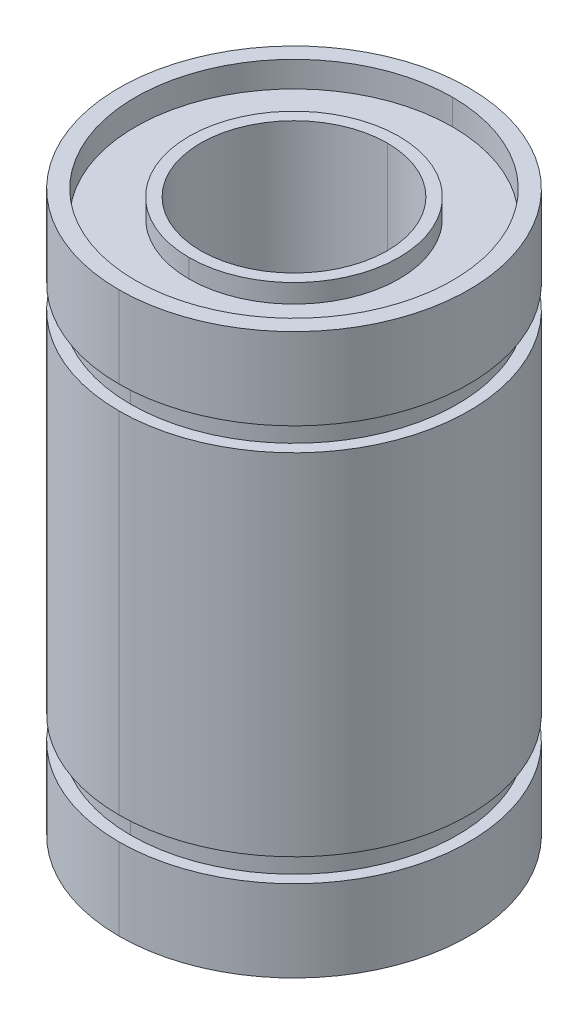
ISO-10303-21;
HEADER;
FILE_DESCRIPTION(('STEP AP214'),'2;1');
FILE_NAME('part.step','',(''),(''),'','','');
FILE_SCHEMA(('AUTOMOTIVE_DESIGN { 1 0 10303 214 1 1 1 1 }'));
ENDSEC;
DATA;
#1=APPLICATION_CONTEXT('core data for automotive mechanical design processes');
#2=APPLICATION_PROTOCOL_DEFINITION('international standard','automotive_design',2000,#1);
#3=PRODUCT_CONTEXT('',#1,'mechanical');
#4=PRODUCT('Part','Part','',(#3));
#5=PRODUCT_RELATED_PRODUCT_CATEGORY('part','',(#4));
#6=PRODUCT_DEFINITION_FORMATION('','',#4);
#7=PRODUCT_DEFINITION_CONTEXT('part definition',#1,'design');
#8=PRODUCT_DEFINITION('design','',#6,#7);
#9=PRODUCT_DEFINITION_SHAPE('','',#8);
#10=(LENGTH_UNIT() NAMED_UNIT(*) SI_UNIT(.MILLI.,.METRE.));
#11=(NAMED_UNIT(*) PLANE_ANGLE_UNIT() SI_UNIT($,.RADIAN.));
#12=(NAMED_UNIT(*) SI_UNIT($,.STERADIAN.) SOLID_ANGLE_UNIT());
#13=UNCERTAINTY_MEASURE_WITH_UNIT(LENGTH_MEASURE(1.E-05),#10,'distance_accuracy_value','');
#14=(GEOMETRIC_REPRESENTATION_CONTEXT(3) GLOBAL_UNCERTAINTY_ASSIGNED_CONTEXT((#13)) GLOBAL_UNIT_ASSIGNED_CONTEXT((#10,
#11,#12)) REPRESENTATION_CONTEXT('',''));
#15=CARTESIAN_POINT('',(0.,0.,0.));
#16=DIRECTION('',(0.,0.,1.));
#17=DIRECTION('',(1.,0.,0.));
#18=AXIS2_PLACEMENT_3D('',#15,#16,#17);
#19=CARTESIAN_POINT('',(0.,-10.5,0.));
#20=DIRECTION('',(0.,-1.,0.));
#21=DIRECTION('',(0.,0.,1.));
#22=AXIS2_PLACEMENT_3D('',#19,#20,#21);
#23=CYLINDRICAL_SURFACE('',#22,4.5);
#24=CARTESIAN_POINT('',(0.,-10.9,0.));
#25=DIRECTION('',(0.,1.,0.));
#26=DIRECTION('',(0.,0.,1.));
#27=AXIS2_PLACEMENT_3D('',#24,#25,#26);
#28=CIRCLE('',#27,4.5);
#29=CARTESIAN_POINT('',(0.,-10.9,-4.5));
#30=VERTEX_POINT('',#29);
#31=CARTESIAN_POINT('',(0.,-10.9,4.5));
#32=VERTEX_POINT('',#31);
#33=EDGE_CURVE('E40',#30,#32,#28,.T.);
#34=ORIENTED_EDGE('',*,*,#33,.F.);
#35=DIRECTION('',(0.,-1.,0.));
#36=VECTOR('',#35,1.);
#37=CARTESIAN_POINT('',(0.,-10.5,-4.5));
#38=LINE('',#37,#36);
#39=CARTESIAN_POINT('',(0.,-11.7,-4.5));
#40=VERTEX_POINT('',#39);
#41=EDGE_CURVE('E10',#30,#40,#38,.T.);
#42=ORIENTED_EDGE('',*,*,#41,.T.);
#43=CARTESIAN_POINT('',(0.,-11.7,0.));
#44=DIRECTION('',(0.,1.,0.));
#45=DIRECTION('',(0.,0.,1.));
#46=AXIS2_PLACEMENT_3D('',#43,#44,#45);
#47=CIRCLE('',#46,4.5);
#48=CARTESIAN_POINT('',(0.,-11.7,4.5));
#49=VERTEX_POINT('',#48);
#50=EDGE_CURVE('E26',#40,#49,#47,.T.);
#51=ORIENTED_EDGE('',*,*,#50,.T.);
#52=DIRECTION('',(0.,-1.,0.));
#53=VECTOR('',#52,1.);
#54=CARTESIAN_POINT('',(0.,-10.5,4.5));
#55=LINE('',#54,#53);
#56=EDGE_CURVE('E187',#32,#49,#55,.T.);
#57=ORIENTED_EDGE('',*,*,#56,.F.);
#58=EDGE_LOOP('',(#34,#42,#51,#57));
#59=FACE_BOUND('',#58,.T.);
#60=ADVANCED_FACE('F15',(#59),#23,.T.);
#61=CARTESIAN_POINT('',(0.,-10.5,0.));
#62=DIRECTION('',(0.,-1.,0.));
#63=DIRECTION('',(0.,0.,1.));
#64=AXIS2_PLACEMENT_3D('',#61,#62,#63);
#65=CYLINDRICAL_SURFACE('',#64,6.8);
#66=CARTESIAN_POINT('',(0.,-10.9,0.));
#67=DIRECTION('',(0.,1.,0.));
#68=DIRECTION('',(0.,0.,1.));
#69=AXIS2_PLACEMENT_3D('',#66,#67,#68);
#70=CIRCLE('',#69,6.8);
#71=CARTESIAN_POINT('',(0.,-10.9,6.8));
#72=VERTEX_POINT('',#71);
#73=CARTESIAN_POINT('',(0.,-10.9,-6.8));
#74=VERTEX_POINT('',#73);
#75=EDGE_CURVE('E159',#72,#74,#70,.T.);
#76=ORIENTED_EDGE('',*,*,#75,.T.);
#77=DIRECTION('',(0.,-1.,0.));
#78=VECTOR('',#77,1.);
#79=CARTESIAN_POINT('',(0.,-10.5,-6.8));
#80=LINE('',#79,#78);
#81=CARTESIAN_POINT('',(0.,-12.,-6.8));
#82=VERTEX_POINT('',#81);
#83=EDGE_CURVE('E136',#74,#82,#80,.T.);
#84=ORIENTED_EDGE('',*,*,#83,.T.);
#85=CARTESIAN_POINT('',(0.,-12.,0.));
#86=DIRECTION('',(0.,1.,0.));
#87=DIRECTION('',(0.,0.,1.));
#88=AXIS2_PLACEMENT_3D('',#85,#86,#87);
#89=CIRCLE('',#88,6.8);
#90=CARTESIAN_POINT('',(0.,-12.,6.8));
#91=VERTEX_POINT('',#90);
#92=EDGE_CURVE('E213',#91,#82,#89,.T.);
#93=ORIENTED_EDGE('',*,*,#92,.F.);
#94=DIRECTION('',(0.,-1.,0.));
#95=VECTOR('',#94,1.);
#96=CARTESIAN_POINT('',(0.,-10.5,6.8));
#97=LINE('',#96,#95);
#98=EDGE_CURVE('E308',#72,#91,#97,.T.);
#99=ORIENTED_EDGE('',*,*,#98,.F.);
#100=EDGE_LOOP('',(#76,#84,#93,#99));
#101=FACE_BOUND('',#100,.T.);
#102=ADVANCED_FACE('F373',(#101),#65,.F.);
#103=CARTESIAN_POINT('',(0.,-7.5,0.));
#104=DIRECTION('',(0.,-1.,0.));
#105=DIRECTION('',(0.,0.,-1.));
#106=AXIS2_PLACEMENT_3D('',#103,#104,#105);
#107=CYLINDRICAL_SURFACE('',#106,7.);
#108=CARTESIAN_POINT('',(0.,-7.5,0.));
#109=DIRECTION('',(0.,1.,0.));
#110=DIRECTION('',(0.,0.,1.));
#111=AXIS2_PLACEMENT_3D('',#108,#109,#110);
#112=CIRCLE('',#111,7.);
#113=CARTESIAN_POINT('',(0.,-7.5,7.));
#114=VERTEX_POINT('',#113);
#115=CARTESIAN_POINT('',(0.,-7.5,-7.));
#116=VERTEX_POINT('',#115);
#117=EDGE_CURVE('E119',#114,#116,#112,.T.);
#118=ORIENTED_EDGE('',*,*,#117,.F.);
#119=DIRECTION('',(0.,-1.,0.));
#120=VECTOR('',#119,1.);
#121=CARTESIAN_POINT('',(0.,-7.5,7.));
#122=LINE('',#121,#120);
#123=CARTESIAN_POINT('',(0.,-8.5,7.));
#124=VERTEX_POINT('',#123);
#125=EDGE_CURVE('E122',#114,#124,#122,.T.);
#126=ORIENTED_EDGE('',*,*,#125,.T.);
#127=CARTESIAN_POINT('',(0.,-8.5,0.));
#128=DIRECTION('',(0.,1.,0.));
#129=DIRECTION('',(0.,0.,1.));
#130=AXIS2_PLACEMENT_3D('',#127,#128,#129);
#131=CIRCLE('',#130,7.);
#132=CARTESIAN_POINT('',(0.,-8.5,-7.));
#133=VERTEX_POINT('',#132);
#134=EDGE_CURVE('E110',#124,#133,#131,.T.);
#135=ORIENTED_EDGE('',*,*,#134,.T.);
#136=DIRECTION('',(0.,-1.,0.));
#137=VECTOR('',#136,1.);
#138=CARTESIAN_POINT('',(0.,-7.5,-7.));
#139=LINE('',#138,#137);
#140=EDGE_CURVE('E124',#116,#133,#139,.T.);
#141=ORIENTED_EDGE('',*,*,#140,.F.);
#142=EDGE_LOOP('',(#118,#126,#135,#141));
#143=FACE_BOUND('',#142,.T.);
#144=ADVANCED_FACE('F121',(#143),#107,.T.);
#145=CARTESIAN_POINT('',(0.,10.5,0.));
#146=DIRECTION('',(0.,1.,0.));
#147=DIRECTION('',(0.,0.,1.));
#148=AXIS2_PLACEMENT_3D('',#145,#146,#147);
#149=CYLINDRICAL_SURFACE('',#148,4.5);
#150=CARTESIAN_POINT('',(0.,10.9,0.));
#151=DIRECTION('',(0.,1.,0.));
#152=DIRECTION('',(0.,0.,1.));
#153=AXIS2_PLACEMENT_3D('',#150,#151,#152);
#154=CIRCLE('',#153,4.5);
#155=CARTESIAN_POINT('',(0.,10.9,4.5));
#156=VERTEX_POINT('',#155);
#157=CARTESIAN_POINT('',(0.,10.9,-4.5));
#158=VERTEX_POINT('',#157);
#159=EDGE_CURVE('E228',#156,#158,#154,.T.);
#160=ORIENTED_EDGE('',*,*,#159,.T.);
#161=DIRECTION('',(0.,1.,0.));
#162=VECTOR('',#161,1.);
#163=CARTESIAN_POINT('',(0.,10.5,-4.5));
#164=LINE('',#163,#162);
#165=CARTESIAN_POINT('',(0.,11.7,-4.5));
#166=VERTEX_POINT('',#165);
#167=EDGE_CURVE('E224',#158,#166,#164,.T.);
#168=ORIENTED_EDGE('',*,*,#167,.T.);
#169=CARTESIAN_POINT('',(0.,11.7,0.));
#170=DIRECTION('',(0.,1.,0.));
#171=DIRECTION('',(0.,0.,1.));
#172=AXIS2_PLACEMENT_3D('',#169,#170,#171);
#173=CIRCLE('',#172,4.5);
#174=CARTESIAN_POINT('',(0.,11.7,4.5));
#175=VERTEX_POINT('',#174);
#176=EDGE_CURVE('E203',#175,#166,#173,.T.);
#177=ORIENTED_EDGE('',*,*,#176,.F.);
#178=DIRECTION('',(0.,1.,0.));
#179=VECTOR('',#178,1.);
#180=CARTESIAN_POINT('',(0.,10.5,4.5));
#181=LINE('',#180,#179);
#182=EDGE_CURVE('E233',#156,#175,#181,.T.);
#183=ORIENTED_EDGE('',*,*,#182,.F.);
#184=EDGE_LOOP('',(#160,#168,#177,#183));
#185=FACE_BOUND('',#184,.T.);
#186=ADVANCED_FACE('F681',(#185),#149,.T.);
#187=CARTESIAN_POINT('',(0.,10.5,0.));
#188=DIRECTION('',(0.,1.,0.));
#189=DIRECTION('',(0.,0.,1.));
#190=AXIS2_PLACEMENT_3D('',#187,#188,#189);
#191=CYLINDRICAL_SURFACE('',#190,6.8);
#192=CARTESIAN_POINT('',(0.,10.9,0.));
#193=DIRECTION('',(0.,1.,0.));
#194=DIRECTION('',(0.,0.,1.));
#195=AXIS2_PLACEMENT_3D('',#192,#193,#194);
#196=CIRCLE('',#195,6.8);
#197=CARTESIAN_POINT('',(0.,10.9,-6.8));
#198=VERTEX_POINT('',#197);
#199=CARTESIAN_POINT('',(0.,10.9,6.8));
#200=VERTEX_POINT('',#199);
#201=EDGE_CURVE('E140',#198,#200,#196,.T.);
#202=ORIENTED_EDGE('',*,*,#201,.F.);
#203=DIRECTION('',(0.,1.,0.));
#204=VECTOR('',#203,1.);
#205=CARTESIAN_POINT('',(0.,10.5,-6.8));
#206=LINE('',#205,#204);
#207=CARTESIAN_POINT('',(0.,12.,-6.8));
#208=VERTEX_POINT('',#207);
#209=EDGE_CURVE('E19',#198,#208,#206,.T.);
#210=ORIENTED_EDGE('',*,*,#209,.T.);
#211=CARTESIAN_POINT('',(0.,12.,0.));
#212=DIRECTION('',(0.,1.,0.));
#213=DIRECTION('',(0.,0.,1.));
#214=AXIS2_PLACEMENT_3D('',#211,#212,#213);
#215=CIRCLE('',#214,6.8);
#216=CARTESIAN_POINT('',(0.,12.,6.8));
#217=VERTEX_POINT('',#216);
#218=EDGE_CURVE('E280',#208,#217,#215,.T.);
#219=ORIENTED_EDGE('',*,*,#218,.T.);
#220=DIRECTION('',(0.,1.,0.));
#221=VECTOR('',#220,1.);
#222=CARTESIAN_POINT('',(0.,10.5,6.8));
#223=LINE('',#222,#221);
#224=EDGE_CURVE('E163',#200,#217,#223,.T.);
#225=ORIENTED_EDGE('',*,*,#224,.F.);
#226=EDGE_LOOP('',(#202,#210,#219,#225));
#227=FACE_BOUND('',#226,.T.);
#228=ADVANCED_FACE('F418',(#227),#191,.F.);
#229=CARTESIAN_POINT('',(0.,7.5,0.));
#230=DIRECTION('',(0.,1.,0.));
#231=DIRECTION('',(0.,0.,1.));
#232=AXIS2_PLACEMENT_3D('',#229,#230,#231);
#233=CYLINDRICAL_SURFACE('',#232,7.);
#234=CARTESIAN_POINT('',(0.,7.5,0.));
#235=DIRECTION('',(0.,1.,0.));
#236=DIRECTION('',(0.,0.,1.));
#237=AXIS2_PLACEMENT_3D('',#234,#235,#236);
#238=CIRCLE('',#237,7.);
#239=CARTESIAN_POINT('',(0.,7.5,7.));
#240=VERTEX_POINT('',#239);
#241=CARTESIAN_POINT('',(0.,7.5,-7.));
#242=VERTEX_POINT('',#241);
#243=EDGE_CURVE('E276',#240,#242,#238,.T.);
#244=ORIENTED_EDGE('',*,*,#243,.T.);
#245=DIRECTION('',(0.,1.,0.));
#246=VECTOR('',#245,1.);
#247=CARTESIAN_POINT('',(0.,7.5,-7.));
#248=LINE('',#247,#246);
#249=CARTESIAN_POINT('',(0.,8.5,-7.));
#250=VERTEX_POINT('',#249);
#251=EDGE_CURVE('E281',#242,#250,#248,.T.);
#252=ORIENTED_EDGE('',*,*,#251,.T.);
#253=CARTESIAN_POINT('',(0.,8.5,0.));
#254=DIRECTION('',(0.,1.,0.));
#255=DIRECTION('',(0.,0.,1.));
#256=AXIS2_PLACEMENT_3D('',#253,#254,#255);
#257=CIRCLE('',#256,7.);
#258=CARTESIAN_POINT('',(0.,8.5,7.));
#259=VERTEX_POINT('',#258);
#260=EDGE_CURVE('E285',#259,#250,#257,.T.);
#261=ORIENTED_EDGE('',*,*,#260,.F.);
#262=DIRECTION('',(0.,1.,0.));
#263=VECTOR('',#262,1.);
#264=CARTESIAN_POINT('',(0.,7.5,7.));
#265=LINE('',#264,#263);
#266=EDGE_CURVE('E152',#240,#259,#265,.T.);
#267=ORIENTED_EDGE('',*,*,#266,.F.);
#268=EDGE_LOOP('',(#244,#252,#261,#267));
#269=FACE_BOUND('',#268,.T.);
#270=ADVANCED_FACE('F415',(#269),#233,.T.);
#271=CARTESIAN_POINT('',(0.,12.,0.));
#272=DIRECTION('',(0.,-1.,0.));
#273=DIRECTION('',(0.,0.,-1.));
#274=AXIS2_PLACEMENT_3D('',#271,#272,#273);
#275=CYLINDRICAL_SURFACE('',#274,7.5);
#276=CARTESIAN_POINT('',(0.,12.,0.));
#277=DIRECTION('',(0.,1.,0.));
#278=DIRECTION('',(0.,0.,1.));
#279=AXIS2_PLACEMENT_3D('',#276,#277,#278);
#280=CIRCLE('',#279,7.5);
#281=CARTESIAN_POINT('',(0.,12.,7.5));
#282=VERTEX_POINT('',#281);
#283=CARTESIAN_POINT('',(0.,12.,-7.5));
#284=VERTEX_POINT('',#283);
#285=EDGE_CURVE('E202',#282,#284,#280,.T.);
#286=ORIENTED_EDGE('',*,*,#285,.F.);
#287=DIRECTION('',(0.,-1.,0.));
#288=VECTOR('',#287,1.);
#289=CARTESIAN_POINT('',(0.,12.,7.5));
#290=LINE('',#289,#288);
#291=CARTESIAN_POINT('',(0.,8.5,7.5));
#292=VERTEX_POINT('',#291);
#293=EDGE_CURVE('E301',#282,#292,#290,.T.);
#294=ORIENTED_EDGE('',*,*,#293,.T.);
#295=CARTESIAN_POINT('',(0.,8.5,0.));
#296=DIRECTION('',(0.,1.,0.));
#297=DIRECTION('',(0.,0.,1.));
#298=AXIS2_PLACEMENT_3D('',#295,#296,#297);
#299=CIRCLE('',#298,7.5);
#300=CARTESIAN_POINT('',(0.,8.5,-7.5));
#301=VERTEX_POINT('',#300);
#302=EDGE_CURVE('E232',#292,#301,#299,.T.);
#303=ORIENTED_EDGE('',*,*,#302,.T.);
#304=DIRECTION('',(0.,-1.,0.));
#305=VECTOR('',#304,1.);
#306=CARTESIAN_POINT('',(0.,12.,-7.5));
#307=LINE('',#306,#305);
#308=EDGE_CURVE('E193',#284,#301,#307,.T.);
#309=ORIENTED_EDGE('',*,*,#308,.F.);
#310=EDGE_LOOP('',(#286,#294,#303,#309));
#311=FACE_BOUND('',#310,.T.);
#312=ADVANCED_FACE('F393',(#311),#275,.T.);
#313=CARTESIAN_POINT('',(0.,12.,0.));
#314=DIRECTION('',(0.,-1.,0.));
#315=DIRECTION('',(0.,0.,-1.));
#316=AXIS2_PLACEMENT_3D('',#313,#314,#315);
#317=CYLINDRICAL_SURFACE('',#316,7.5);
#318=CARTESIAN_POINT('',(0.,-8.5,0.));
#319=DIRECTION('',(0.,1.,0.));
#320=DIRECTION('',(0.,0.,1.));
#321=AXIS2_PLACEMENT_3D('',#318,#319,#320);
#322=CIRCLE('',#321,7.5);
#323=CARTESIAN_POINT('',(0.,-8.5,7.5));
#324=VERTEX_POINT('',#323);
#325=CARTESIAN_POINT('',(0.,-8.5,-7.5));
#326=VERTEX_POINT('',#325);
#327=EDGE_CURVE('E182',#324,#326,#322,.T.);
#328=ORIENTED_EDGE('',*,*,#327,.F.);
#329=DIRECTION('',(0.,-1.,0.));
#330=VECTOR('',#329,1.);
#331=CARTESIAN_POINT('',(0.,12.,7.5));
#332=LINE('',#331,#330);
#333=CARTESIAN_POINT('',(0.,-12.,7.5));
#334=VERTEX_POINT('',#333);
#335=EDGE_CURVE('E186',#324,#334,#332,.T.);
#336=ORIENTED_EDGE('',*,*,#335,.T.);
#337=CARTESIAN_POINT('',(0.,-12.,0.));
#338=DIRECTION('',(0.,1.,0.));
#339=DIRECTION('',(0.,0.,1.));
#340=AXIS2_PLACEMENT_3D('',#337,#338,#339);
#341=CIRCLE('',#340,7.5);
#342=CARTESIAN_POINT('',(0.,-12.,-7.5));
#343=VERTEX_POINT('',#342);
#344=EDGE_CURVE('E157',#334,#343,#341,.T.);
#345=ORIENTED_EDGE('',*,*,#344,.T.);
#346=DIRECTION('',(0.,-1.,0.));
#347=VECTOR('',#346,1.);
#348=CARTESIAN_POINT('',(0.,12.,-7.5));
#349=LINE('',#348,#347);
#350=EDGE_CURVE('E238',#326,#343,#349,.T.);
#351=ORIENTED_EDGE('',*,*,#350,.F.);
#352=EDGE_LOOP('',(#328,#336,#345,#351));
#353=FACE_BOUND('',#352,.T.);
#354=ADVANCED_FACE('F389',(#353),#317,.T.);
#355=CARTESIAN_POINT('',(0.,12.,0.));
#356=DIRECTION('',(0.,-1.,0.));
#357=DIRECTION('',(0.,0.,-1.));
#358=AXIS2_PLACEMENT_3D('',#355,#356,#357);
#359=CYLINDRICAL_SURFACE('',#358,7.5);
#360=CARTESIAN_POINT('',(0.,7.5,0.));
#361=DIRECTION('',(0.,1.,0.));
#362=DIRECTION('',(0.,0.,1.));
#363=AXIS2_PLACEMENT_3D('',#360,#361,#362);
#364=CIRCLE('',#363,7.5);
#365=CARTESIAN_POINT('',(0.,7.5,7.5));
#366=VERTEX_POINT('',#365);
#367=CARTESIAN_POINT('',(0.,7.5,-7.5));
#368=VERTEX_POINT('',#367);
#369=EDGE_CURVE('E282',#366,#368,#364,.T.);
#370=ORIENTED_EDGE('',*,*,#369,.F.);
#371=DIRECTION('',(0.,-1.,0.));
#372=VECTOR('',#371,1.);
#373=CARTESIAN_POINT('',(0.,12.,7.5));
#374=LINE('',#373,#372);
#375=CARTESIAN_POINT('',(0.,-7.5,7.5));
#376=VERTEX_POINT('',#375);
#377=EDGE_CURVE('E154',#366,#376,#374,.T.);
#378=ORIENTED_EDGE('',*,*,#377,.T.);
#379=CARTESIAN_POINT('',(0.,-7.5,0.));
#380=DIRECTION('',(0.,1.,0.));
#381=DIRECTION('',(0.,0.,1.));
#382=AXIS2_PLACEMENT_3D('',#379,#380,#381);
#383=CIRCLE('',#382,7.5);
#384=CARTESIAN_POINT('',(0.,-7.5,-7.5));
#385=VERTEX_POINT('',#384);
#386=EDGE_CURVE('E158',#376,#385,#383,.T.);
#387=ORIENTED_EDGE('',*,*,#386,.T.);
#388=DIRECTION('',(0.,-1.,0.));
#389=VECTOR('',#388,1.);
#390=CARTESIAN_POINT('',(0.,12.,-7.5));
#391=LINE('',#390,#389);
#392=EDGE_CURVE('E168',#368,#385,#391,.T.);
#393=ORIENTED_EDGE('',*,*,#392,.F.);
#394=EDGE_LOOP('',(#370,#378,#387,#393));
#395=FACE_BOUND('',#394,.T.);
#396=ADVANCED_FACE('F392',(#395),#359,.T.);
#397=CARTESIAN_POINT('',(0.,-12.,0.));
#398=DIRECTION('',(0.,1.,0.));
#399=DIRECTION('',(0.,0.,1.));
#400=AXIS2_PLACEMENT_3D('',#397,#398,#399);
#401=CYLINDRICAL_SURFACE('',#400,4.);
#402=CARTESIAN_POINT('',(0.,-11.7,0.));
#403=DIRECTION('',(0.,1.,0.));
#404=DIRECTION('',(0.,0.,1.));
#405=AXIS2_PLACEMENT_3D('',#402,#403,#404);
#406=CIRCLE('',#405,4.);
#407=CARTESIAN_POINT('',(0.,-11.7,-4.));
#408=VERTEX_POINT('',#407);
#409=CARTESIAN_POINT('',(0.,-11.7,4.));
#410=VERTEX_POINT('',#409);
#411=EDGE_CURVE('E191',#408,#410,#406,.T.);
#412=ORIENTED_EDGE('',*,*,#411,.F.);
#413=DIRECTION('',(0.,1.,0.));
#414=VECTOR('',#413,1.);
#415=CARTESIAN_POINT('',(0.,-12.,-4.));
#416=LINE('',#415,#414);
#417=CARTESIAN_POINT('',(0.,11.7,-4.));
#418=VERTEX_POINT('',#417);
#419=EDGE_CURVE('E174',#408,#418,#416,.T.);
#420=ORIENTED_EDGE('',*,*,#419,.T.);
#421=CARTESIAN_POINT('',(0.,11.7,0.));
#422=DIRECTION('',(0.,1.,0.));
#423=DIRECTION('',(0.,0.,1.));
#424=AXIS2_PLACEMENT_3D('',#421,#422,#423);
#425=CIRCLE('',#424,4.);
#426=CARTESIAN_POINT('',(0.,11.7,4.));
#427=VERTEX_POINT('',#426);
#428=EDGE_CURVE('E178',#418,#427,#425,.T.);
#429=ORIENTED_EDGE('',*,*,#428,.T.);
#430=DIRECTION('',(0.,1.,0.));
#431=VECTOR('',#430,1.);
#432=CARTESIAN_POINT('',(0.,-12.,4.));
#433=LINE('',#432,#431);
#434=EDGE_CURVE('E212',#410,#427,#433,.T.);
#435=ORIENTED_EDGE('',*,*,#434,.F.);
#436=EDGE_LOOP('',(#412,#420,#429,#435));
#437=FACE_BOUND('',#436,.T.);
#438=ADVANCED_FACE('F433',(#437),#401,.F.);
#439=CARTESIAN_POINT('',(0.,-12.,0.));
#440=DIRECTION('',(0.,1.,0.));
#441=DIRECTION('',(0.,0.,1.));
#442=AXIS2_PLACEMENT_3D('',#439,#440,#441);
#443=CYLINDRICAL_SURFACE('',#442,4.);
#444=ORIENTED_EDGE('',*,*,#419,.F.);
#445=CARTESIAN_POINT('',(0.,-11.7,0.));
#446=DIRECTION('',(0.,1.,0.));
#447=DIRECTION('',(0.,0.,1.));
#448=AXIS2_PLACEMENT_3D('',#445,#446,#447);
#449=CIRCLE('',#448,4.);
#450=EDGE_CURVE('E311',#410,#408,#449,.T.);
#451=ORIENTED_EDGE('',*,*,#450,.F.);
#452=ORIENTED_EDGE('',*,*,#434,.T.);
#453=CARTESIAN_POINT('',(0.,11.7,0.));
#454=DIRECTION('',(0.,1.,0.));
#455=DIRECTION('',(0.,0.,1.));
#456=AXIS2_PLACEMENT_3D('',#453,#454,#455);
#457=CIRCLE('',#456,4.);
#458=EDGE_CURVE('E208',#427,#418,#457,.T.);
#459=ORIENTED_EDGE('',*,*,#458,.T.);
#460=EDGE_LOOP('',(#444,#451,#452,#459));
#461=FACE_BOUND('',#460,.T.);
#462=ADVANCED_FACE('F387',(#461),#443,.F.);
#463=CARTESIAN_POINT('',(0.,-12.,0.));
#464=DIRECTION('',(0.,1.,0.));
#465=DIRECTION('',(1.,0.,0.));
#466=AXIS2_PLACEMENT_3D('',#463,#464,#465);
#467=PLANE('',#466);
#468=CARTESIAN_POINT('',(0.,-12.,0.));
#469=DIRECTION('',(0.,1.,0.));
#470=DIRECTION('',(0.,0.,1.));
#471=AXIS2_PLACEMENT_3D('',#468,#469,#470);
#472=CIRCLE('',#471,7.5);
#473=EDGE_CURVE('E195',#343,#334,#472,.T.);
#474=ORIENTED_EDGE('',*,*,#473,.F.);
#475=ORIENTED_EDGE('',*,*,#344,.F.);
#476=EDGE_LOOP('',(#474,#475));
#477=FACE_BOUND('',#476,.T.);
#478=ORIENTED_EDGE('',*,*,#92,.T.);
#479=CARTESIAN_POINT('',(0.,-12.,0.));
#480=DIRECTION('',(0.,1.,0.));
#481=DIRECTION('',(0.,0.,1.));
#482=AXIS2_PLACEMENT_3D('',#479,#480,#481);
#483=CIRCLE('',#482,6.8);
#484=EDGE_CURVE('E172',#82,#91,#483,.T.);
#485=ORIENTED_EDGE('',*,*,#484,.T.);
#486=EDGE_LOOP('',(#478,#485));
#487=FACE_BOUND('',#486,.T.);
#488=ADVANCED_FACE('F383',(#477,#487),#467,.F.);
#489=CARTESIAN_POINT('',(0.,12.,0.));
#490=DIRECTION('',(0.,-1.,0.));
#491=DIRECTION('',(0.,0.,-1.));
#492=AXIS2_PLACEMENT_3D('',#489,#490,#491);
#493=CYLINDRICAL_SURFACE('',#492,7.5);
#494=ORIENTED_EDGE('',*,*,#377,.F.);
#495=CARTESIAN_POINT('',(0.,7.5,0.));
#496=DIRECTION('',(0.,1.,0.));
#497=DIRECTION('',(0.,0.,1.));
#498=AXIS2_PLACEMENT_3D('',#495,#496,#497);
#499=CIRCLE('',#498,7.5);
#500=EDGE_CURVE('E223',#368,#366,#499,.T.);
#501=ORIENTED_EDGE('',*,*,#500,.F.);
#502=ORIENTED_EDGE('',*,*,#392,.T.);
#503=CARTESIAN_POINT('',(0.,-7.5,0.));
#504=DIRECTION('',(0.,1.,0.));
#505=DIRECTION('',(0.,0.,1.));
#506=AXIS2_PLACEMENT_3D('',#503,#504,#505);
#507=CIRCLE('',#506,7.5);
#508=EDGE_CURVE('E173',#385,#376,#507,.T.);
#509=ORIENTED_EDGE('',*,*,#508,.T.);
#510=EDGE_LOOP('',(#494,#501,#502,#509));
#511=FACE_BOUND('',#510,.T.);
#512=ADVANCED_FACE('F386',(#511),#493,.T.);
#513=CARTESIAN_POINT('',(0.,12.,0.));
#514=DIRECTION('',(0.,1.,0.));
#515=DIRECTION('',(1.,0.,0.));
#516=AXIS2_PLACEMENT_3D('',#513,#514,#515);
#517=PLANE('',#516);
#518=CARTESIAN_POINT('',(0.,12.,0.));
#519=DIRECTION('',(0.,1.,0.));
#520=DIRECTION('',(0.,0.,1.));
#521=AXIS2_PLACEMENT_3D('',#518,#519,#520);
#522=CIRCLE('',#521,7.5);
#523=EDGE_CURVE('E198',#284,#282,#522,.T.);
#524=ORIENTED_EDGE('',*,*,#523,.T.);
#525=ORIENTED_EDGE('',*,*,#285,.T.);
#526=EDGE_LOOP('',(#524,#525));
#527=FACE_BOUND('',#526,.T.);
#528=CARTESIAN_POINT('',(0.,12.,0.));
#529=DIRECTION('',(0.,1.,0.));
#530=DIRECTION('',(0.,0.,1.));
#531=AXIS2_PLACEMENT_3D('',#528,#529,#530);
#532=CIRCLE('',#531,6.8);
#533=EDGE_CURVE('E167',#217,#208,#532,.T.);
#534=ORIENTED_EDGE('',*,*,#533,.F.);
#535=ORIENTED_EDGE('',*,*,#218,.F.);
#536=EDGE_LOOP('',(#534,#535));
#537=FACE_BOUND('',#536,.T.);
#538=ADVANCED_FACE('F402',(#527,#537),#517,.T.);
#539=CARTESIAN_POINT('',(0.,12.,0.));
#540=DIRECTION('',(0.,-1.,0.));
#541=DIRECTION('',(0.,0.,-1.));
#542=AXIS2_PLACEMENT_3D('',#539,#540,#541);
#543=CYLINDRICAL_SURFACE('',#542,7.5);
#544=ORIENTED_EDGE('',*,*,#335,.F.);
#545=CARTESIAN_POINT('',(0.,-8.5,0.));
#546=DIRECTION('',(0.,1.,0.));
#547=DIRECTION('',(0.,0.,1.));
#548=AXIS2_PLACEMENT_3D('',#545,#546,#547);
#549=CIRCLE('',#548,7.5);
#550=EDGE_CURVE('E130',#326,#324,#549,.T.);
#551=ORIENTED_EDGE('',*,*,#550,.F.);
#552=ORIENTED_EDGE('',*,*,#350,.T.);
#553=ORIENTED_EDGE('',*,*,#473,.T.);
#554=EDGE_LOOP('',(#544,#551,#552,#553));
#555=FACE_BOUND('',#554,.T.);
#556=ADVANCED_FACE('F398',(#555),#543,.T.);
#557=CARTESIAN_POINT('',(0.,12.,0.));
#558=DIRECTION('',(0.,-1.,0.));
#559=DIRECTION('',(0.,0.,-1.));
#560=AXIS2_PLACEMENT_3D('',#557,#558,#559);
#561=CYLINDRICAL_SURFACE('',#560,7.5);
#562=ORIENTED_EDGE('',*,*,#293,.F.);
#563=ORIENTED_EDGE('',*,*,#523,.F.);
#564=ORIENTED_EDGE('',*,*,#308,.T.);
#565=CARTESIAN_POINT('',(0.,8.5,0.));
#566=DIRECTION('',(0.,1.,0.));
#567=DIRECTION('',(0.,0.,1.));
#568=AXIS2_PLACEMENT_3D('',#565,#566,#567);
#569=CIRCLE('',#568,7.5);
#570=EDGE_CURVE('E196',#301,#292,#569,.T.);
#571=ORIENTED_EDGE('',*,*,#570,.T.);
#572=EDGE_LOOP('',(#562,#563,#564,#571));
#573=FACE_BOUND('',#572,.T.);
#574=ADVANCED_FACE('F395',(#573),#561,.T.);
#575=CARTESIAN_POINT('',(0.,7.5,0.));
#576=DIRECTION('',(0.,1.,0.));
#577=DIRECTION('',(1.,0.,0.));
#578=AXIS2_PLACEMENT_3D('',#575,#576,#577);
#579=PLANE('',#578);
#580=ORIENTED_EDGE('',*,*,#500,.T.);
#581=ORIENTED_EDGE('',*,*,#369,.T.);
#582=EDGE_LOOP('',(#580,#581));
#583=FACE_BOUND('',#582,.T.);
#584=ORIENTED_EDGE('',*,*,#243,.F.);
#585=CARTESIAN_POINT('',(0.,7.5,0.));
#586=DIRECTION('',(0.,1.,0.));
#587=DIRECTION('',(0.,0.,1.));
#588=AXIS2_PLACEMENT_3D('',#585,#586,#587);
#589=CIRCLE('',#588,7.);
#590=EDGE_CURVE('E344',#242,#240,#589,.T.);
#591=ORIENTED_EDGE('',*,*,#590,.F.);
#592=EDGE_LOOP('',(#584,#591));
#593=FACE_BOUND('',#592,.T.);
#594=ADVANCED_FACE('F17',(#583,#593),#579,.T.);
#595=CARTESIAN_POINT('',(0.,8.5,0.));
#596=DIRECTION('',(0.,1.,0.));
#597=DIRECTION('',(1.,0.,0.));
#598=AXIS2_PLACEMENT_3D('',#595,#596,#597);
#599=PLANE('',#598);
#600=ORIENTED_EDGE('',*,*,#570,.F.);
#601=ORIENTED_EDGE('',*,*,#302,.F.);
#602=EDGE_LOOP('',(#600,#601));
#603=FACE_BOUND('',#602,.T.);
#604=ORIENTED_EDGE('',*,*,#260,.T.);
#605=CARTESIAN_POINT('',(0.,8.5,0.));
#606=DIRECTION('',(0.,1.,0.));
#607=DIRECTION('',(0.,0.,1.));
#608=AXIS2_PLACEMENT_3D('',#605,#606,#607);
#609=CIRCLE('',#608,7.);
#610=EDGE_CURVE('E288',#250,#259,#609,.T.);
#611=ORIENTED_EDGE('',*,*,#610,.T.);
#612=EDGE_LOOP('',(#604,#611));
#613=FACE_BOUND('',#612,.T.);
#614=ADVANCED_FACE('F413',(#603,#613),#599,.F.);
#615=CARTESIAN_POINT('',(0.,7.5,0.));
#616=DIRECTION('',(0.,1.,0.));
#617=DIRECTION('',(0.,0.,1.));
#618=AXIS2_PLACEMENT_3D('',#615,#616,#617);
#619=CYLINDRICAL_SURFACE('',#618,7.);
#620=ORIENTED_EDGE('',*,*,#251,.F.);
#621=ORIENTED_EDGE('',*,*,#590,.T.);
#622=ORIENTED_EDGE('',*,*,#266,.T.);
#623=ORIENTED_EDGE('',*,*,#610,.F.);
#624=EDGE_LOOP('',(#620,#621,#622,#623));
#625=FACE_BOUND('',#624,.T.);
#626=ADVANCED_FACE('F410',(#625),#619,.T.);
#627=CARTESIAN_POINT('',(0.,10.5,0.));
#628=DIRECTION('',(0.,1.,0.));
#629=DIRECTION('',(0.,0.,1.));
#630=AXIS2_PLACEMENT_3D('',#627,#628,#629);
#631=CYLINDRICAL_SURFACE('',#630,6.8);
#632=ORIENTED_EDGE('',*,*,#209,.F.);
#633=CARTESIAN_POINT('',(0.,10.9,0.));
#634=DIRECTION('',(0.,1.,0.));
#635=DIRECTION('',(0.,0.,1.));
#636=AXIS2_PLACEMENT_3D('',#633,#634,#635);
#637=CIRCLE('',#636,6.8);
#638=EDGE_CURVE('E148',#200,#198,#637,.T.);
#639=ORIENTED_EDGE('',*,*,#638,.F.);
#640=ORIENTED_EDGE('',*,*,#224,.T.);
#641=ORIENTED_EDGE('',*,*,#533,.T.);
#642=EDGE_LOOP('',(#632,#639,#640,#641));
#643=FACE_BOUND('',#642,.T.);
#644=ADVANCED_FACE('F408',(#643),#631,.F.);
#645=CARTESIAN_POINT('',(0.,11.7,-4.));
#646=DIRECTION('',(0.,1.,0.));
#647=DIRECTION('',(1.,0.,0.));
#648=AXIS2_PLACEMENT_3D('',#645,#646,#647);
#649=PLANE('',#648);
#650=ORIENTED_EDGE('',*,*,#176,.T.);
#651=CARTESIAN_POINT('',(0.,11.7,0.));
#652=DIRECTION('',(0.,1.,0.));
#653=DIRECTION('',(0.,0.,1.));
#654=AXIS2_PLACEMENT_3D('',#651,#652,#653);
#655=CIRCLE('',#654,4.5);
#656=EDGE_CURVE('E207',#166,#175,#655,.T.);
#657=ORIENTED_EDGE('',*,*,#656,.T.);
#658=EDGE_LOOP('',(#650,#657));
#659=FACE_BOUND('',#658,.T.);
#660=ORIENTED_EDGE('',*,*,#458,.F.);
#661=ORIENTED_EDGE('',*,*,#428,.F.);
#662=EDGE_LOOP('',(#660,#661));
#663=FACE_BOUND('',#662,.T.);
#664=ADVANCED_FACE('F404',(#659,#663),#649,.T.);
#665=CARTESIAN_POINT('',(0.,10.5,0.));
#666=DIRECTION('',(0.,1.,0.));
#667=DIRECTION('',(0.,0.,1.));
#668=AXIS2_PLACEMENT_3D('',#665,#666,#667);
#669=CYLINDRICAL_SURFACE('',#668,4.5);
#670=ORIENTED_EDGE('',*,*,#167,.F.);
#671=CARTESIAN_POINT('',(0.,10.9,0.));
#672=DIRECTION('',(0.,1.,0.));
#673=DIRECTION('',(0.,0.,1.));
#674=AXIS2_PLACEMENT_3D('',#671,#672,#673);
#675=CIRCLE('',#674,4.5);
#676=EDGE_CURVE('E237',#158,#156,#675,.T.);
#677=ORIENTED_EDGE('',*,*,#676,.T.);
#678=ORIENTED_EDGE('',*,*,#182,.T.);
#679=ORIENTED_EDGE('',*,*,#656,.F.);
#680=EDGE_LOOP('',(#670,#677,#678,#679));
#681=FACE_BOUND('',#680,.T.);
#682=ADVANCED_FACE('F407',(#681),#669,.T.);
#683=CARTESIAN_POINT('',(0.,10.9,-4.5));
#684=DIRECTION('',(0.,1.,0.));
#685=DIRECTION('',(1.,0.,0.));
#686=AXIS2_PLACEMENT_3D('',#683,#684,#685);
#687=PLANE('',#686);
#688=ORIENTED_EDGE('',*,*,#638,.T.);
#689=ORIENTED_EDGE('',*,*,#201,.T.);
#690=EDGE_LOOP('',(#688,#689));
#691=FACE_BOUND('',#690,.T.);
#692=ORIENTED_EDGE('',*,*,#159,.F.);
#693=ORIENTED_EDGE('',*,*,#676,.F.);
#694=EDGE_LOOP('',(#692,#693));
#695=FACE_BOUND('',#694,.T.);
#696=ADVANCED_FACE('F367',(#691,#695),#687,.T.);
#697=CARTESIAN_POINT('',(0.,-7.5,0.));
#698=DIRECTION('',(0.,-1.,0.));
#699=DIRECTION('',(0.,0.,-1.));
#700=AXIS2_PLACEMENT_3D('',#697,#698,#699);
#701=PLANE('',#700);
#702=ORIENTED_EDGE('',*,*,#508,.F.);
#703=ORIENTED_EDGE('',*,*,#386,.F.);
#704=EDGE_LOOP('',(#702,#703));
#705=FACE_BOUND('',#704,.T.);
#706=CARTESIAN_POINT('',(0.,-7.5,0.));
#707=DIRECTION('',(0.,1.,0.));
#708=DIRECTION('',(0.,0.,1.));
#709=AXIS2_PLACEMENT_3D('',#706,#707,#708);
#710=CIRCLE('',#709,7.);
#711=EDGE_CURVE('E129',#116,#114,#710,.T.);
#712=ORIENTED_EDGE('',*,*,#711,.T.);
#713=ORIENTED_EDGE('',*,*,#117,.T.);
#714=EDGE_LOOP('',(#712,#713));
#715=FACE_BOUND('',#714,.T.);
#716=ADVANCED_FACE('F138',(#705,#715),#701,.T.);
#717=CARTESIAN_POINT('',(0.,-8.5,0.));
#718=DIRECTION('',(0.,-1.,0.));
#719=DIRECTION('',(0.,0.,-1.));
#720=AXIS2_PLACEMENT_3D('',#717,#718,#719);
#721=PLANE('',#720);
#722=ORIENTED_EDGE('',*,*,#550,.T.);
#723=ORIENTED_EDGE('',*,*,#327,.T.);
#724=EDGE_LOOP('',(#722,#723));
#725=FACE_BOUND('',#724,.T.);
#726=CARTESIAN_POINT('',(0.,-8.5,0.));
#727=DIRECTION('',(0.,1.,0.));
#728=DIRECTION('',(0.,0.,1.));
#729=AXIS2_PLACEMENT_3D('',#726,#727,#728);
#730=CIRCLE('',#729,7.);
#731=EDGE_CURVE('E134',#133,#124,#730,.T.);
#732=ORIENTED_EDGE('',*,*,#731,.F.);
#733=ORIENTED_EDGE('',*,*,#134,.F.);
#734=EDGE_LOOP('',(#732,#733));
#735=FACE_BOUND('',#734,.T.);
#736=ADVANCED_FACE('F356',(#725,#735),#721,.F.);
#737=CARTESIAN_POINT('',(0.,-7.5,0.));
#738=DIRECTION('',(0.,-1.,0.));
#739=DIRECTION('',(0.,0.,-1.));
#740=AXIS2_PLACEMENT_3D('',#737,#738,#739);
#741=CYLINDRICAL_SURFACE('',#740,7.);
#742=ORIENTED_EDGE('',*,*,#125,.F.);
#743=ORIENTED_EDGE('',*,*,#711,.F.);
#744=ORIENTED_EDGE('',*,*,#140,.T.);
#745=ORIENTED_EDGE('',*,*,#731,.T.);
#746=EDGE_LOOP('',(#742,#743,#744,#745));
#747=FACE_BOUND('',#746,.T.);
#748=ADVANCED_FACE('F133',(#747),#741,.T.);
#749=CARTESIAN_POINT('',(0.,-10.5,0.));
#750=DIRECTION('',(0.,-1.,0.));
#751=DIRECTION('',(0.,0.,1.));
#752=AXIS2_PLACEMENT_3D('',#749,#750,#751);
#753=CYLINDRICAL_SURFACE('',#752,6.8);
#754=ORIENTED_EDGE('',*,*,#83,.F.);
#755=CARTESIAN_POINT('',(0.,-10.9,0.));
#756=DIRECTION('',(0.,1.,0.));
#757=DIRECTION('',(0.,0.,1.));
#758=AXIS2_PLACEMENT_3D('',#755,#756,#757);
#759=CIRCLE('',#758,6.8);
#760=EDGE_CURVE('E297',#74,#72,#759,.T.);
#761=ORIENTED_EDGE('',*,*,#760,.T.);
#762=ORIENTED_EDGE('',*,*,#98,.T.);
#763=ORIENTED_EDGE('',*,*,#484,.F.);
#764=EDGE_LOOP('',(#754,#761,#762,#763));
#765=FACE_BOUND('',#764,.T.);
#766=ADVANCED_FACE('F365',(#765),#753,.F.);
#767=CARTESIAN_POINT('',(0.,-11.7,-4.));
#768=DIRECTION('',(0.,-1.,0.));
#769=DIRECTION('',(0.,0.,-1.));
#770=AXIS2_PLACEMENT_3D('',#767,#768,#769);
#771=PLANE('',#770);
#772=CARTESIAN_POINT('',(0.,-11.7,0.));
#773=DIRECTION('',(0.,1.,0.));
#774=DIRECTION('',(0.,0.,1.));
#775=AXIS2_PLACEMENT_3D('',#772,#773,#774);
#776=CIRCLE('',#775,4.5);
#777=EDGE_CURVE('E192',#49,#40,#776,.T.);
#778=ORIENTED_EDGE('',*,*,#777,.F.);
#779=ORIENTED_EDGE('',*,*,#50,.F.);
#780=EDGE_LOOP('',(#778,#779));
#781=FACE_BOUND('',#780,.T.);
#782=ORIENTED_EDGE('',*,*,#450,.T.);
#783=ORIENTED_EDGE('',*,*,#411,.T.);
#784=EDGE_LOOP('',(#782,#783));
#785=FACE_BOUND('',#784,.T.);
#786=ADVANCED_FACE('F436',(#781,#785),#771,.T.);
#787=CARTESIAN_POINT('',(0.,-10.5,0.));
#788=DIRECTION('',(0.,-1.,0.));
#789=DIRECTION('',(0.,0.,1.));
#790=AXIS2_PLACEMENT_3D('',#787,#788,#789);
#791=CYLINDRICAL_SURFACE('',#790,4.5);
#792=ORIENTED_EDGE('',*,*,#41,.F.);
#793=CARTESIAN_POINT('',(0.,-10.9,0.));
#794=DIRECTION('',(0.,1.,0.));
#795=DIRECTION('',(0.,0.,1.));
#796=AXIS2_PLACEMENT_3D('',#793,#794,#795);
#797=CIRCLE('',#796,4.5);
#798=EDGE_CURVE('E216',#32,#30,#797,.T.);
#799=ORIENTED_EDGE('',*,*,#798,.F.);
#800=ORIENTED_EDGE('',*,*,#56,.T.);
#801=ORIENTED_EDGE('',*,*,#777,.T.);
#802=EDGE_LOOP('',(#792,#799,#800,#801));
#803=FACE_BOUND('',#802,.T.);
#804=ADVANCED_FACE('F429',(#803),#791,.T.);
#805=CARTESIAN_POINT('',(0.,-10.9,-4.5));
#806=DIRECTION('',(0.,-1.,0.));
#807=DIRECTION('',(0.,0.,-1.));
#808=AXIS2_PLACEMENT_3D('',#805,#806,#807);
#809=PLANE('',#808);
#810=ORIENTED_EDGE('',*,*,#75,.F.);
#811=ORIENTED_EDGE('',*,*,#760,.F.);
#812=EDGE_LOOP('',(#810,#811));
#813=FACE_BOUND('',#812,.T.);
#814=ORIENTED_EDGE('',*,*,#798,.T.);
#815=ORIENTED_EDGE('',*,*,#33,.T.);
#816=EDGE_LOOP('',(#814,#815));
#817=FACE_BOUND('',#816,.T.);
#818=ADVANCED_FACE('F426',(#813,#817),#809,.T.);
#819=CLOSED_SHELL('',(#60,#102,#144,#186,#228,#270,#312,#354,#396,#438,#462,#488,#512,#538,#556,
#574,#594,#614,#626,#644,#664,#682,#696,#716,#736,#748,#766,#786,#804,#818));
#820=MANIFOLD_SOLID_BREP('B1',#819);
#821=ADVANCED_BREP_SHAPE_REPRESENTATION('',(#18,#820),#14);
#822=SHAPE_DEFINITION_REPRESENTATION(#9,#821);
ENDSEC;
END-ISO-10303-21;
